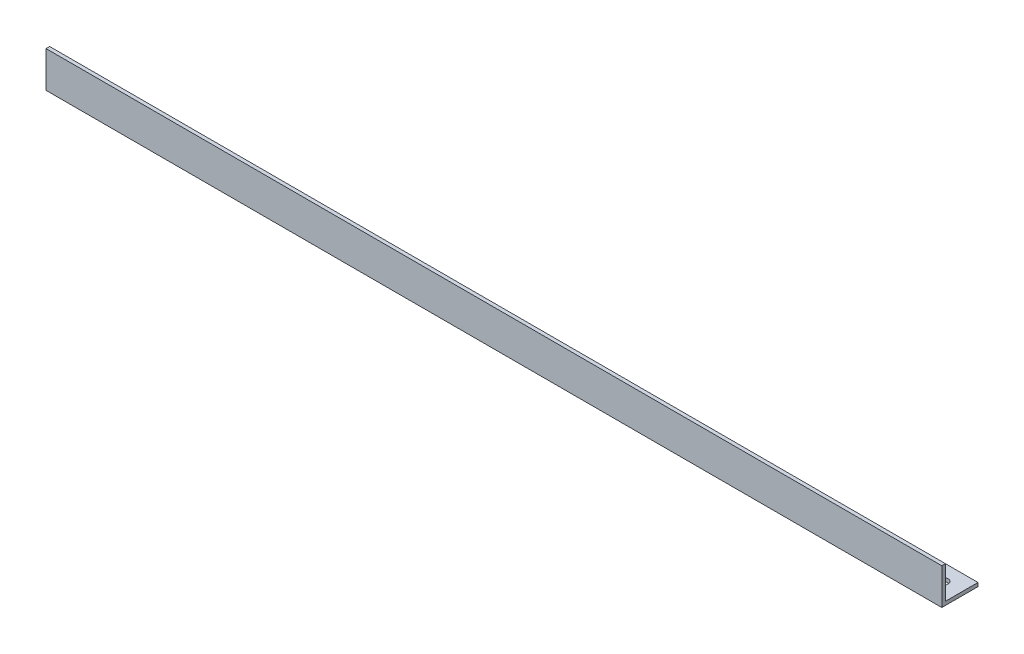
ISO-10303-21;
HEADER;
FILE_DESCRIPTION(('STEP AP214'),'2;1');
FILE_NAME('part.step','',(''),(''),'','','');
FILE_SCHEMA(('AUTOMOTIVE_DESIGN { 1 0 10303 214 1 1 1 1 }'));
ENDSEC;
DATA;
#1=APPLICATION_CONTEXT('core data for automotive mechanical design processes');
#2=APPLICATION_PROTOCOL_DEFINITION('international standard','automotive_design',2000,#1);
#3=PRODUCT_CONTEXT('',#1,'mechanical');
#4=PRODUCT('Part','Part','',(#3));
#5=PRODUCT_RELATED_PRODUCT_CATEGORY('part','',(#4));
#6=PRODUCT_DEFINITION_FORMATION('','',#4);
#7=PRODUCT_DEFINITION_CONTEXT('part definition',#1,'design');
#8=PRODUCT_DEFINITION('design','',#6,#7);
#9=PRODUCT_DEFINITION_SHAPE('','',#8);
#10=(LENGTH_UNIT() NAMED_UNIT(*) SI_UNIT(.MILLI.,.METRE.));
#11=(NAMED_UNIT(*) PLANE_ANGLE_UNIT() SI_UNIT($,.RADIAN.));
#12=(NAMED_UNIT(*) SI_UNIT($,.STERADIAN.) SOLID_ANGLE_UNIT());
#13=UNCERTAINTY_MEASURE_WITH_UNIT(LENGTH_MEASURE(1.E-05),#10,'distance_accuracy_value','');
#14=(GEOMETRIC_REPRESENTATION_CONTEXT(3) GLOBAL_UNCERTAINTY_ASSIGNED_CONTEXT((#13)) GLOBAL_UNIT_ASSIGNED_CONTEXT((#10,
#11,#12)) REPRESENTATION_CONTEXT('',''));
#15=CARTESIAN_POINT('',(0.,0.,0.));
#16=DIRECTION('',(0.,0.,1.));
#17=DIRECTION('',(1.,0.,0.));
#18=AXIS2_PLACEMENT_3D('',#15,#16,#17);
#19=CARTESIAN_POINT('',(-170.,20.,-2.));
#20=DIRECTION('',(0.,1.,0.));
#21=DIRECTION('',(0.,0.,1.));
#22=AXIS2_PLACEMENT_3D('',#19,#20,#21);
#23=PLANE('',#22);
#24=DIRECTION('',(1.,0.,0.));
#25=VECTOR('',#24,1.);
#26=CARTESIAN_POINT('',(-170.,20.,0.));
#27=LINE('',#26,#25);
#28=CARTESIAN_POINT('',(-170.,20.,0.));
#29=VERTEX_POINT('',#28);
#30=CARTESIAN_POINT('',(325.,20.,0.));
#31=VERTEX_POINT('',#30);
#32=EDGE_CURVE('E45',#29,#31,#27,.T.);
#33=ORIENTED_EDGE('',*,*,#32,.T.);
#34=DIRECTION('',(0.,0.,1.));
#35=VECTOR('',#34,1.);
#36=CARTESIAN_POINT('',(325.,20.,-2.));
#37=LINE('',#36,#35);
#38=CARTESIAN_POINT('',(325.,20.,-2.));
#39=VERTEX_POINT('',#38);
#40=EDGE_CURVE('E95',#39,#31,#37,.T.);
#41=ORIENTED_EDGE('',*,*,#40,.F.);
#42=DIRECTION('',(1.,0.,0.));
#43=VECTOR('',#42,1.);
#44=CARTESIAN_POINT('',(-170.,20.,-2.));
#45=LINE('',#44,#43);
#46=CARTESIAN_POINT('',(-170.,20.,-2.));
#47=VERTEX_POINT('',#46);
#48=EDGE_CURVE('E11',#47,#39,#45,.T.);
#49=ORIENTED_EDGE('',*,*,#48,.F.);
#50=DIRECTION('',(0.,0.,1.));
#51=VECTOR('',#50,1.);
#52=CARTESIAN_POINT('',(-170.,20.,-2.));
#53=LINE('',#52,#51);
#54=EDGE_CURVE('E96',#47,#29,#53,.T.);
#55=ORIENTED_EDGE('',*,*,#54,.T.);
#56=EDGE_LOOP('',(#33,#41,#49,#55));
#57=FACE_BOUND('',#56,.T.);
#58=ADVANCED_FACE('F42',(#57),#23,.T.);
#59=CARTESIAN_POINT('',(-170.,2.,-2.));
#60=DIRECTION('',(0.,0.,-1.));
#61=DIRECTION('',(0.,1.,0.));
#62=AXIS2_PLACEMENT_3D('',#59,#60,#61);
#63=PLANE('',#62);
#64=ORIENTED_EDGE('',*,*,#48,.T.);
#65=DIRECTION('',(0.,1.,0.));
#66=VECTOR('',#65,1.);
#67=CARTESIAN_POINT('',(325.,2.,-2.));
#68=LINE('',#67,#66);
#69=CARTESIAN_POINT('',(325.,2.,-2.));
#70=VERTEX_POINT('',#69);
#71=EDGE_CURVE('E115',#70,#39,#68,.T.);
#72=ORIENTED_EDGE('',*,*,#71,.F.);
#73=DIRECTION('',(1.,0.,0.));
#74=VECTOR('',#73,1.);
#75=CARTESIAN_POINT('',(-170.,2.,-2.));
#76=LINE('',#75,#74);
#77=CARTESIAN_POINT('',(-170.,2.,-2.));
#78=VERTEX_POINT('',#77);
#79=EDGE_CURVE('E51',#78,#70,#76,.T.);
#80=ORIENTED_EDGE('',*,*,#79,.F.);
#81=DIRECTION('',(0.,1.,0.));
#82=VECTOR('',#81,1.);
#83=CARTESIAN_POINT('',(-170.,2.,-2.));
#84=LINE('',#83,#82);
#85=EDGE_CURVE('E102',#78,#47,#84,.T.);
#86=ORIENTED_EDGE('',*,*,#85,.T.);
#87=EDGE_LOOP('',(#64,#72,#80,#86));
#88=FACE_BOUND('',#87,.T.);
#89=ADVANCED_FACE('F176',(#88),#63,.T.);
#90=CARTESIAN_POINT('',(-170.,2.,-20.));
#91=DIRECTION('',(0.,1.,0.));
#92=DIRECTION('',(0.,0.,1.));
#93=AXIS2_PLACEMENT_3D('',#90,#91,#92);
#94=PLANE('',#93);
#95=CARTESIAN_POINT('',(-160.,2.,-11.));
#96=DIRECTION('',(0.,1.,0.));
#97=DIRECTION('',(0.,0.,1.));
#98=AXIS2_PLACEMENT_3D('',#95,#96,#97);
#99=CIRCLE('',#98,2.5);
#100=CARTESIAN_POINT('',(-160.,2.,-8.50000000000001));
#101=VERTEX_POINT('',#100);
#102=EDGE_CURVE('E228',#101,#101,#99,.T.);
#103=ORIENTED_EDGE('',*,*,#102,.F.);
#104=EDGE_LOOP('',(#103));
#105=FACE_BOUND('',#104,.T.);
#106=CARTESIAN_POINT('',(315.,2.,-11.));
#107=DIRECTION('',(0.,1.,0.));
#108=DIRECTION('',(0.,0.,1.));
#109=AXIS2_PLACEMENT_3D('',#106,#107,#108);
#110=CIRCLE('',#109,2.50000000000002);
#111=CARTESIAN_POINT('',(315.,2.,-8.49999999999998));
#112=VERTEX_POINT('',#111);
#113=EDGE_CURVE('E221',#112,#112,#110,.T.);
#114=ORIENTED_EDGE('',*,*,#113,.F.);
#115=EDGE_LOOP('',(#114));
#116=FACE_BOUND('',#115,.T.);
#117=CARTESIAN_POINT('',(0.,2.,-9.8));
#118=DIRECTION('',(0.,1.,0.));
#119=DIRECTION('',(0.,0.,1.));
#120=AXIS2_PLACEMENT_3D('',#117,#118,#119);
#121=CIRCLE('',#120,2.95);
#122=CARTESIAN_POINT('',(0.,2.,-6.85));
#123=VERTEX_POINT('',#122);
#124=EDGE_CURVE('E121',#123,#123,#121,.T.);
#125=ORIENTED_EDGE('',*,*,#124,.F.);
#126=EDGE_LOOP('',(#125));
#127=FACE_BOUND('',#126,.T.);
#128=ORIENTED_EDGE('',*,*,#79,.T.);
#129=DIRECTION('',(0.,0.,1.));
#130=VECTOR('',#129,1.);
#131=CARTESIAN_POINT('',(325.,2.,-20.));
#132=LINE('',#131,#130);
#133=CARTESIAN_POINT('',(325.,2.,-20.));
#134=VERTEX_POINT('',#133);
#135=EDGE_CURVE('E131',#134,#70,#132,.T.);
#136=ORIENTED_EDGE('',*,*,#135,.F.);
#137=DIRECTION('',(1.,0.,0.));
#138=VECTOR('',#137,1.);
#139=CARTESIAN_POINT('',(-170.,2.,-20.));
#140=LINE('',#139,#138);
#141=CARTESIAN_POINT('',(-170.,2.,-20.));
#142=VERTEX_POINT('',#141);
#143=EDGE_CURVE('E156',#142,#134,#140,.T.);
#144=ORIENTED_EDGE('',*,*,#143,.F.);
#145=DIRECTION('',(0.,0.,1.));
#146=VECTOR('',#145,1.);
#147=CARTESIAN_POINT('',(-170.,2.,-20.));
#148=LINE('',#147,#146);
#149=EDGE_CURVE('E149',#142,#78,#148,.T.);
#150=ORIENTED_EDGE('',*,*,#149,.T.);
#151=EDGE_LOOP('',(#128,#136,#144,#150));
#152=FACE_BOUND('',#151,.T.);
#153=ADVANCED_FACE('F172',(#105,#116,#127,#152),#94,.T.);
#154=CARTESIAN_POINT('',(-170.,0.,-20.));
#155=DIRECTION('',(0.,0.,-1.));
#156=DIRECTION('',(-1.,0.,0.));
#157=AXIS2_PLACEMENT_3D('',#154,#155,#156);
#158=PLANE('',#157);
#159=ORIENTED_EDGE('',*,*,#143,.T.);
#160=DIRECTION('',(0.,1.,0.));
#161=VECTOR('',#160,1.);
#162=CARTESIAN_POINT('',(325.,0.,-20.));
#163=LINE('',#162,#161);
#164=CARTESIAN_POINT('',(325.,0.,-20.));
#165=VERTEX_POINT('',#164);
#166=EDGE_CURVE('E127',#165,#134,#163,.T.);
#167=ORIENTED_EDGE('',*,*,#166,.F.);
#168=DIRECTION('',(1.,0.,0.));
#169=VECTOR('',#168,1.);
#170=CARTESIAN_POINT('',(-170.,0.,-20.));
#171=LINE('',#170,#169);
#172=CARTESIAN_POINT('',(-170.,0.,-20.));
#173=VERTEX_POINT('',#172);
#174=EDGE_CURVE('E159',#173,#165,#171,.T.);
#175=ORIENTED_EDGE('',*,*,#174,.F.);
#176=DIRECTION('',(0.,1.,0.));
#177=VECTOR('',#176,1.);
#178=CARTESIAN_POINT('',(-170.,0.,-20.));
#179=LINE('',#178,#177);
#180=EDGE_CURVE('E145',#173,#142,#179,.T.);
#181=ORIENTED_EDGE('',*,*,#180,.T.);
#182=EDGE_LOOP('',(#159,#167,#175,#181));
#183=FACE_BOUND('',#182,.T.);
#184=ADVANCED_FACE('F169',(#183),#158,.T.);
#185=CARTESIAN_POINT('',(-170.,0.,0.));
#186=DIRECTION('',(0.,-1.,0.));
#187=DIRECTION('',(0.,0.,-1.));
#188=AXIS2_PLACEMENT_3D('',#185,#186,#187);
#189=PLANE('',#188);
#190=CARTESIAN_POINT('',(-160.,0.,-11.));
#191=DIRECTION('',(0.,1.,0.));
#192=DIRECTION('',(0.,0.,1.));
#193=AXIS2_PLACEMENT_3D('',#190,#191,#192);
#194=CIRCLE('',#193,2.5);
#195=CARTESIAN_POINT('',(-160.,0.,-8.50000000000001));
#196=VERTEX_POINT('',#195);
#197=EDGE_CURVE('E234',#196,#196,#194,.T.);
#198=ORIENTED_EDGE('',*,*,#197,.T.);
#199=EDGE_LOOP('',(#198));
#200=FACE_BOUND('',#199,.T.);
#201=CARTESIAN_POINT('',(315.,0.,-11.));
#202=DIRECTION('',(0.,1.,0.));
#203=DIRECTION('',(0.,0.,1.));
#204=AXIS2_PLACEMENT_3D('',#201,#202,#203);
#205=CIRCLE('',#204,2.50000000000002);
#206=CARTESIAN_POINT('',(315.,0.,-8.49999999999998));
#207=VERTEX_POINT('',#206);
#208=EDGE_CURVE('E218',#207,#207,#205,.T.);
#209=ORIENTED_EDGE('',*,*,#208,.T.);
#210=EDGE_LOOP('',(#209));
#211=FACE_BOUND('',#210,.T.);
#212=CARTESIAN_POINT('',(0.,0.,-9.8));
#213=DIRECTION('',(0.,1.,0.));
#214=DIRECTION('',(0.,0.,1.));
#215=AXIS2_PLACEMENT_3D('',#212,#213,#214);
#216=CIRCLE('',#215,2.95);
#217=CARTESIAN_POINT('',(0.,0.,-6.85));
#218=VERTEX_POINT('',#217);
#219=EDGE_CURVE('E117',#218,#218,#216,.T.);
#220=ORIENTED_EDGE('',*,*,#219,.T.);
#221=EDGE_LOOP('',(#220));
#222=FACE_BOUND('',#221,.T.);
#223=ORIENTED_EDGE('',*,*,#174,.T.);
#224=DIRECTION('',(0.,0.,-1.));
#225=VECTOR('',#224,1.);
#226=CARTESIAN_POINT('',(325.,0.,0.));
#227=LINE('',#226,#225);
#228=CARTESIAN_POINT('',(325.,0.,0.));
#229=VERTEX_POINT('',#228);
#230=EDGE_CURVE('E110',#229,#165,#227,.T.);
#231=ORIENTED_EDGE('',*,*,#230,.F.);
#232=DIRECTION('',(1.,0.,0.));
#233=VECTOR('',#232,1.);
#234=CARTESIAN_POINT('',(-170.,0.,0.));
#235=LINE('',#234,#233);
#236=CARTESIAN_POINT('',(-170.,0.,0.));
#237=VERTEX_POINT('',#236);
#238=EDGE_CURVE('E101',#237,#229,#235,.T.);
#239=ORIENTED_EDGE('',*,*,#238,.F.);
#240=DIRECTION('',(0.,0.,-1.));
#241=VECTOR('',#240,1.);
#242=CARTESIAN_POINT('',(-170.,0.,0.));
#243=LINE('',#242,#241);
#244=EDGE_CURVE('E141',#237,#173,#243,.T.);
#245=ORIENTED_EDGE('',*,*,#244,.T.);
#246=EDGE_LOOP('',(#223,#231,#239,#245));
#247=FACE_BOUND('',#246,.T.);
#248=ADVANCED_FACE('F163',(#200,#211,#222,#247),#189,.T.);
#249=CARTESIAN_POINT('',(-170.,20.,0.));
#250=DIRECTION('',(0.,0.,1.));
#251=DIRECTION('',(1.,0.,0.));
#252=AXIS2_PLACEMENT_3D('',#249,#250,#251);
#253=PLANE('',#252);
#254=ORIENTED_EDGE('',*,*,#238,.T.);
#255=DIRECTION('',(0.,-1.,0.));
#256=VECTOR('',#255,1.);
#257=CARTESIAN_POINT('',(325.,20.,0.));
#258=LINE('',#257,#256);
#259=EDGE_CURVE('E104',#31,#229,#258,.T.);
#260=ORIENTED_EDGE('',*,*,#259,.F.);
#261=ORIENTED_EDGE('',*,*,#32,.F.);
#262=DIRECTION('',(0.,-1.,0.));
#263=VECTOR('',#262,1.);
#264=CARTESIAN_POINT('',(-170.,20.,0.));
#265=LINE('',#264,#263);
#266=EDGE_CURVE('E138',#29,#237,#265,.T.);
#267=ORIENTED_EDGE('',*,*,#266,.T.);
#268=EDGE_LOOP('',(#254,#260,#261,#267));
#269=FACE_BOUND('',#268,.T.);
#270=ADVANCED_FACE('F105',(#269),#253,.T.);
#271=CARTESIAN_POINT('',(-170.,0.,0.));
#272=DIRECTION('',(1.,0.,0.));
#273=DIRECTION('',(0.,0.,-1.));
#274=AXIS2_PLACEMENT_3D('',#271,#272,#273);
#275=PLANE('',#274);
#276=ORIENTED_EDGE('',*,*,#54,.F.);
#277=ORIENTED_EDGE('',*,*,#85,.F.);
#278=ORIENTED_EDGE('',*,*,#149,.F.);
#279=ORIENTED_EDGE('',*,*,#180,.F.);
#280=ORIENTED_EDGE('',*,*,#244,.F.);
#281=ORIENTED_EDGE('',*,*,#266,.F.);
#282=EDGE_LOOP('',(#276,#277,#278,#279,#280,#281));
#283=FACE_BOUND('',#282,.T.);
#284=ADVANCED_FACE('F175',(#283),#275,.F.);
#285=CARTESIAN_POINT('',(325.,0.,0.));
#286=DIRECTION('',(1.,0.,0.));
#287=DIRECTION('',(0.,0.,-1.));
#288=AXIS2_PLACEMENT_3D('',#285,#286,#287);
#289=PLANE('',#288);
#290=ORIENTED_EDGE('',*,*,#40,.T.);
#291=ORIENTED_EDGE('',*,*,#259,.T.);
#292=ORIENTED_EDGE('',*,*,#230,.T.);
#293=ORIENTED_EDGE('',*,*,#166,.T.);
#294=ORIENTED_EDGE('',*,*,#135,.T.);
#295=ORIENTED_EDGE('',*,*,#71,.T.);
#296=EDGE_LOOP('',(#290,#291,#292,#293,#294,#295));
#297=FACE_BOUND('',#296,.T.);
#298=ADVANCED_FACE('F113',(#297),#289,.T.);
#299=CARTESIAN_POINT('',(0.,0.,-9.8));
#300=DIRECTION('',(0.,1.,0.));
#301=DIRECTION('',(0.,0.,1.));
#302=AXIS2_PLACEMENT_3D('',#299,#300,#301);
#303=CYLINDRICAL_SURFACE('',#302,2.95);
#304=ORIENTED_EDGE('',*,*,#219,.F.);
#305=EDGE_LOOP('',(#304));
#306=FACE_BOUND('',#305,.T.);
#307=ORIENTED_EDGE('',*,*,#124,.T.);
#308=EDGE_LOOP('',(#307));
#309=FACE_BOUND('',#308,.T.);
#310=ADVANCED_FACE('F199',(#306,#309),#303,.F.);
#311=CARTESIAN_POINT('',(315.,0.,-11.));
#312=DIRECTION('',(0.,1.,0.));
#313=DIRECTION('',(0.,0.,1.));
#314=AXIS2_PLACEMENT_3D('',#311,#312,#313);
#315=CYLINDRICAL_SURFACE('',#314,2.50000000000002);
#316=ORIENTED_EDGE('',*,*,#208,.F.);
#317=EDGE_LOOP('',(#316));
#318=FACE_BOUND('',#317,.T.);
#319=ORIENTED_EDGE('',*,*,#113,.T.);
#320=EDGE_LOOP('',(#319));
#321=FACE_BOUND('',#320,.T.);
#322=ADVANCED_FACE('F203',(#318,#321),#315,.F.);
#323=CARTESIAN_POINT('',(-160.,0.,-11.));
#324=DIRECTION('',(0.,1.,0.));
#325=DIRECTION('',(0.,0.,1.));
#326=AXIS2_PLACEMENT_3D('',#323,#324,#325);
#327=CYLINDRICAL_SURFACE('',#326,2.5);
#328=ORIENTED_EDGE('',*,*,#197,.F.);
#329=EDGE_LOOP('',(#328));
#330=FACE_BOUND('',#329,.T.);
#331=ORIENTED_EDGE('',*,*,#102,.T.);
#332=EDGE_LOOP('',(#331));
#333=FACE_BOUND('',#332,.T.);
#334=ADVANCED_FACE('F207',(#330,#333),#327,.F.);
#335=CLOSED_SHELL('',(#58,#89,#153,#184,#248,#270,#284,#298,#310,#322,#334));
#336=MANIFOLD_SOLID_BREP('B2',#335);
#337=ADVANCED_BREP_SHAPE_REPRESENTATION('',(#18,#336),#14);
#338=SHAPE_DEFINITION_REPRESENTATION(#9,#337);
ENDSEC;
END-ISO-10303-21;
